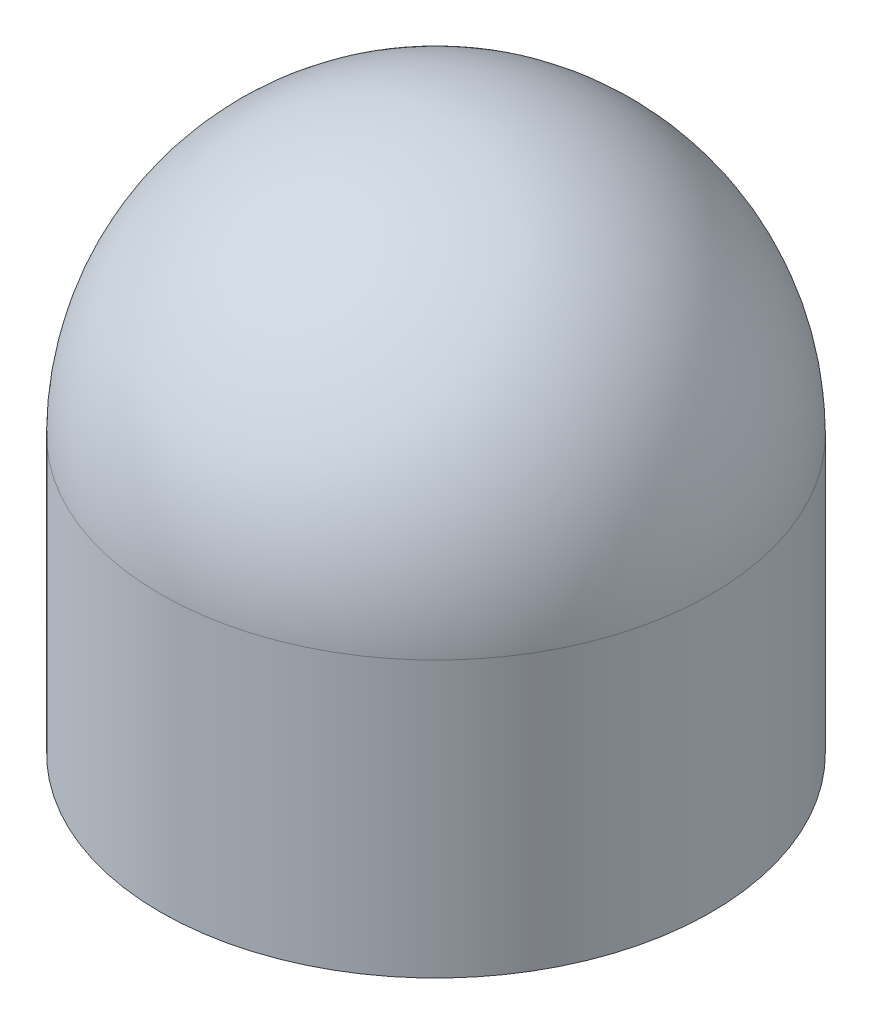
ISO-10303-21;
HEADER;
FILE_DESCRIPTION(('STEP AP214'),'2;1');
FILE_NAME('part.step','',(''),(''),'','','');
FILE_SCHEMA(('AUTOMOTIVE_DESIGN { 1 0 10303 214 1 1 1 1 }'));
ENDSEC;
DATA;
#1=APPLICATION_CONTEXT('core data for automotive mechanical design processes');
#2=APPLICATION_PROTOCOL_DEFINITION('international standard','automotive_design',2000,#1);
#3=PRODUCT_CONTEXT('',#1,'mechanical');
#4=PRODUCT('Part','Part','',(#3));
#5=PRODUCT_RELATED_PRODUCT_CATEGORY('part','',(#4));
#6=PRODUCT_DEFINITION_FORMATION('','',#4);
#7=PRODUCT_DEFINITION_CONTEXT('part definition',#1,'design');
#8=PRODUCT_DEFINITION('design','',#6,#7);
#9=PRODUCT_DEFINITION_SHAPE('','',#8);
#10=(LENGTH_UNIT() NAMED_UNIT(*) SI_UNIT(.MILLI.,.METRE.));
#11=(NAMED_UNIT(*) PLANE_ANGLE_UNIT() SI_UNIT($,.RADIAN.));
#12=(NAMED_UNIT(*) SI_UNIT($,.STERADIAN.) SOLID_ANGLE_UNIT());
#13=UNCERTAINTY_MEASURE_WITH_UNIT(LENGTH_MEASURE(1.E-05),#10,'distance_accuracy_value','');
#14=(GEOMETRIC_REPRESENTATION_CONTEXT(3) GLOBAL_UNCERTAINTY_ASSIGNED_CONTEXT((#13)) GLOBAL_UNIT_ASSIGNED_CONTEXT((#10,
#11,#12)) REPRESENTATION_CONTEXT('',''));
#15=CARTESIAN_POINT('',(0.,0.,0.));
#16=DIRECTION('',(0.,0.,1.));
#17=DIRECTION('',(1.,0.,0.));
#18=AXIS2_PLACEMENT_3D('',#15,#16,#17);
#19=CARTESIAN_POINT('',(0.,0.125,0.));
#20=DIRECTION('',(0.,-1.,0.));
#21=DIRECTION('',(0.,0.,-1.));
#22=AXIS2_PLACEMENT_3D('',#19,#20,#21);
#23=CYLINDRICAL_SURFACE('',#22,0.125);
#24=CARTESIAN_POINT('',(0.,0.125,0.));
#25=DIRECTION('',(0.,1.,0.));
#26=DIRECTION('',(0.,0.,1.));
#27=AXIS2_PLACEMENT_3D('',#24,#25,#26);
#28=CIRCLE('',#27,0.125);
#29=CARTESIAN_POINT('',(0.,0.125,0.125));
#30=VERTEX_POINT('',#29);
#31=EDGE_CURVE('E10',#30,#30,#28,.T.);
#32=ORIENTED_EDGE('',*,*,#31,.F.);
#33=EDGE_LOOP('',(#32));
#34=FACE_BOUND('',#33,.T.);
#35=CARTESIAN_POINT('',(0.,0.,0.));
#36=DIRECTION('',(0.,1.,0.));
#37=DIRECTION('',(0.,0.,1.));
#38=AXIS2_PLACEMENT_3D('',#35,#36,#37);
#39=CIRCLE('',#38,0.125);
#40=CARTESIAN_POINT('',(0.,0.,0.125));
#41=VERTEX_POINT('',#40);
#42=EDGE_CURVE('E36',#41,#41,#39,.T.);
#43=ORIENTED_EDGE('',*,*,#42,.T.);
#44=EDGE_LOOP('',(#43));
#45=FACE_BOUND('',#44,.T.);
#46=ADVANCED_FACE('F29',(#34,#45),#23,.T.);
#47=CARTESIAN_POINT('',(0.,0.125,0.));
#48=DIRECTION('',(0.,0.,1.));
#49=DIRECTION('',(1.,0.,0.));
#50=AXIS2_PLACEMENT_3D('',#47,#48,#49);
#51=SPHERICAL_SURFACE('',#50,0.125);
#52=CARTESIAN_POINT('',(0.,0.125,0.));
#53=DIRECTION('',(0.,1.,0.));
#54=DIRECTION('',(0.,0.,1.));
#55=AXIS2_PLACEMENT_3D('',#52,#53,#54);
#56=SPHERICAL_SURFACE('',#55,0.125);
#57=ORIENTED_EDGE('',*,*,#31,.T.);
#58=EDGE_LOOP('',(#57));
#59=FACE_BOUND('',#58,.T.);
#60=ADVANCED_FACE('F31',(#59),#56,.T.);
#61=CARTESIAN_POINT('',(0.,0.,0.));
#62=DIRECTION('',(0.,1.,0.));
#63=DIRECTION('',(0.,0.,1.));
#64=AXIS2_PLACEMENT_3D('',#61,#62,#63);
#65=PLANE('',#64);
#66=ORIENTED_EDGE('',*,*,#42,.F.);
#67=EDGE_LOOP('',(#66));
#68=FACE_BOUND('',#67,.T.);
#69=ADVANCED_FACE('F43',(#68),#65,.F.);
#70=CLOSED_SHELL('',(#46,#60,#69));
#71=MANIFOLD_SOLID_BREP('B2',#70);
#72=ADVANCED_BREP_SHAPE_REPRESENTATION('',(#18,#71),#14);
#73=SHAPE_DEFINITION_REPRESENTATION(#9,#72);
ENDSEC;
END-ISO-10303-21;
